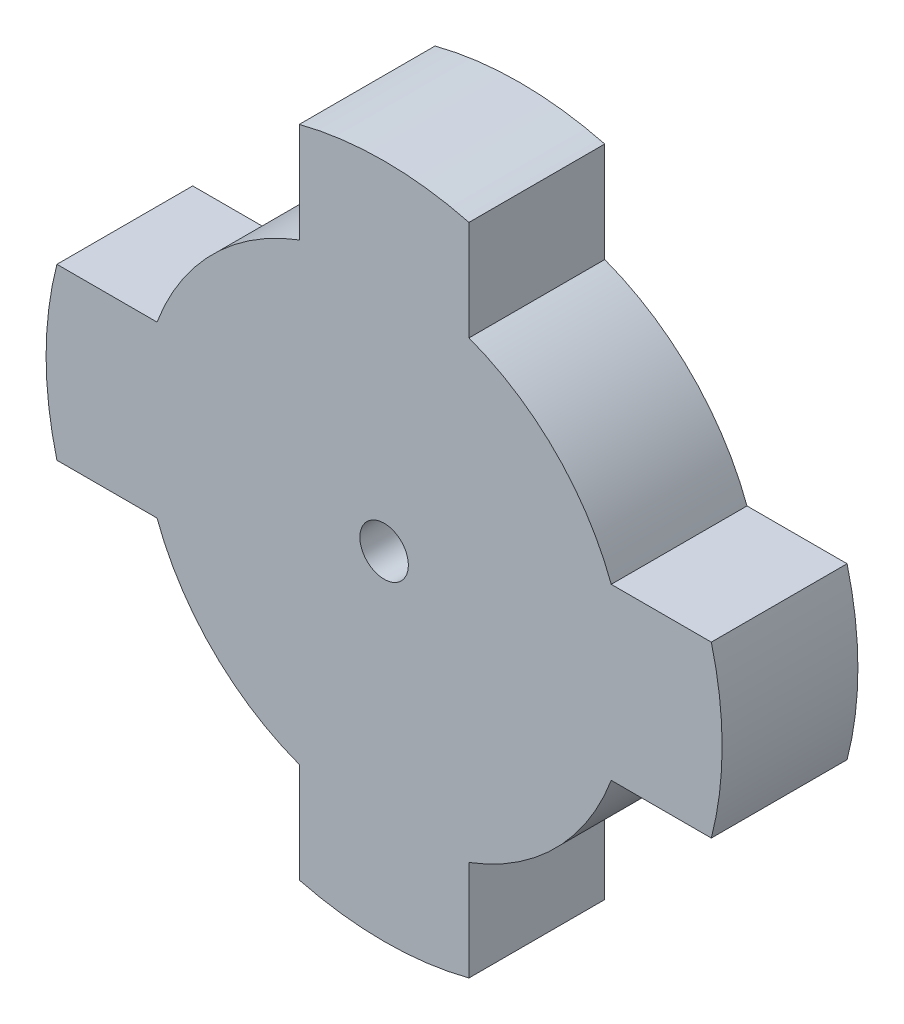
ISO-10303-21;
HEADER;
FILE_DESCRIPTION(('STEP AP214'),'2;1');
FILE_NAME('part.step','',(''),(''),'','','');
FILE_SCHEMA(('AUTOMOTIVE_DESIGN { 1 0 10303 214 1 1 1 1 }'));
ENDSEC;
DATA;
#1=APPLICATION_CONTEXT('core data for automotive mechanical design processes');
#2=APPLICATION_PROTOCOL_DEFINITION('international standard','automotive_design',2000,#1);
#3=PRODUCT_CONTEXT('',#1,'mechanical');
#4=PRODUCT('Part','Part','',(#3));
#5=PRODUCT_RELATED_PRODUCT_CATEGORY('part','',(#4));
#6=PRODUCT_DEFINITION_FORMATION('','',#4);
#7=PRODUCT_DEFINITION_CONTEXT('part definition',#1,'design');
#8=PRODUCT_DEFINITION('design','',#6,#7);
#9=PRODUCT_DEFINITION_SHAPE('','',#8);
#10=(LENGTH_UNIT() NAMED_UNIT(*) SI_UNIT(.MILLI.,.METRE.));
#11=(NAMED_UNIT(*) PLANE_ANGLE_UNIT() SI_UNIT($,.RADIAN.));
#12=(NAMED_UNIT(*) SI_UNIT($,.STERADIAN.) SOLID_ANGLE_UNIT());
#13=UNCERTAINTY_MEASURE_WITH_UNIT(LENGTH_MEASURE(1.E-05),#10,'distance_accuracy_value','');
#14=(GEOMETRIC_REPRESENTATION_CONTEXT(3) GLOBAL_UNCERTAINTY_ASSIGNED_CONTEXT((#13)) GLOBAL_UNIT_ASSIGNED_CONTEXT((#10,
#11,#12)) REPRESENTATION_CONTEXT('',''));
#15=CARTESIAN_POINT('',(0.,0.,0.));
#16=DIRECTION('',(0.,0.,1.));
#17=DIRECTION('',(1.,0.,0.));
#18=AXIS2_PLACEMENT_3D('',#15,#16,#17);
#19=CARTESIAN_POINT('',(0.,0.,14.));
#20=DIRECTION('',(0.,0.,1.));
#21=DIRECTION('',(1.,0.,0.));
#22=AXIS2_PLACEMENT_3D('',#19,#20,#21);
#23=PLANE('',#22);
#24=CARTESIAN_POINT('',(0.,0.,14.));
#25=DIRECTION('',(0.,0.,1.));
#26=DIRECTION('',(1.,0.,0.));
#27=AXIS2_PLACEMENT_3D('',#24,#25,#26);
#28=CIRCLE('',#27,25.);
#29=CARTESIAN_POINT('',(23.418742493994,8.75,14.));
#30=VERTEX_POINT('',#29);
#31=CARTESIAN_POINT('',(8.75,23.418742493994,14.));
#32=VERTEX_POINT('',#31);
#33=EDGE_CURVE('E212',#30,#32,#28,.T.);
#34=ORIENTED_EDGE('',*,*,#33,.T.);
#35=DIRECTION('',(0.,1.,0.));
#36=VECTOR('',#35,1.);
#37=CARTESIAN_POINT('',(8.75,33.7378187340218,14.));
#38=LINE('',#37,#36);
#39=CARTESIAN_POINT('',(8.75,33.7378187340218,14.));
#40=VERTEX_POINT('',#39);
#41=EDGE_CURVE('E120',#32,#40,#38,.T.);
#42=ORIENTED_EDGE('',*,*,#41,.T.);
#43=CARTESIAN_POINT('',(0.,0.,14.));
#44=DIRECTION('',(0.,0.,1.));
#45=DIRECTION('',(1.,0.,0.));
#46=AXIS2_PLACEMENT_3D('',#43,#44,#45);
#47=CIRCLE('',#46,34.8540229088367);
#48=CARTESIAN_POINT('',(-8.75,33.7378187340218,14.));
#49=VERTEX_POINT('',#48);
#50=EDGE_CURVE('E251',#40,#49,#47,.T.);
#51=ORIENTED_EDGE('',*,*,#50,.T.);
#52=DIRECTION('',(0.,-1.,0.));
#53=VECTOR('',#52,1.);
#54=CARTESIAN_POINT('',(-8.75,33.7378187340218,14.));
#55=LINE('',#54,#53);
#56=CARTESIAN_POINT('',(-8.75,23.418742493994,14.));
#57=VERTEX_POINT('',#56);
#58=EDGE_CURVE('E270',#49,#57,#55,.T.);
#59=ORIENTED_EDGE('',*,*,#58,.T.);
#60=CARTESIAN_POINT('',(0.,0.,14.));
#61=DIRECTION('',(0.,0.,1.));
#62=DIRECTION('',(1.,0.,0.));
#63=AXIS2_PLACEMENT_3D('',#60,#61,#62);
#64=CIRCLE('',#63,25.);
#65=CARTESIAN_POINT('',(-23.418742493994,8.75,14.));
#66=VERTEX_POINT('',#65);
#67=EDGE_CURVE('E267',#57,#66,#64,.T.);
#68=ORIENTED_EDGE('',*,*,#67,.T.);
#69=DIRECTION('',(-1.,0.,0.));
#70=VECTOR('',#69,1.);
#71=CARTESIAN_POINT('',(-33.7378187340218,8.74999999999999,14.));
#72=LINE('',#71,#70);
#73=CARTESIAN_POINT('',(-33.7378187340218,8.74999999999999,14.));
#74=VERTEX_POINT('',#73);
#75=EDGE_CURVE('E269',#66,#74,#72,.T.);
#76=ORIENTED_EDGE('',*,*,#75,.T.);
#77=CARTESIAN_POINT('',(0.,0.,14.));
#78=DIRECTION('',(0.,0.,1.));
#79=DIRECTION('',(1.,0.,0.));
#80=AXIS2_PLACEMENT_3D('',#77,#78,#79);
#81=CIRCLE('',#80,34.8540229088367);
#82=CARTESIAN_POINT('',(-33.7378187340218,-8.75,14.));
#83=VERTEX_POINT('',#82);
#84=EDGE_CURVE('E272',#74,#83,#81,.T.);
#85=ORIENTED_EDGE('',*,*,#84,.T.);
#86=DIRECTION('',(1.,0.,0.));
#87=VECTOR('',#86,1.);
#88=CARTESIAN_POINT('',(-33.7378187340218,-8.75000000000001,14.));
#89=LINE('',#88,#87);
#90=CARTESIAN_POINT('',(-23.418742493994,-8.75,14.));
#91=VERTEX_POINT('',#90);
#92=EDGE_CURVE('E278',#83,#91,#89,.T.);
#93=ORIENTED_EDGE('',*,*,#92,.T.);
#94=CARTESIAN_POINT('',(0.,0.,14.));
#95=DIRECTION('',(0.,0.,1.));
#96=DIRECTION('',(1.,0.,0.));
#97=AXIS2_PLACEMENT_3D('',#94,#95,#96);
#98=CIRCLE('',#97,25.);
#99=CARTESIAN_POINT('',(-8.75,-23.418742493994,14.));
#100=VERTEX_POINT('',#99);
#101=EDGE_CURVE('E280',#91,#100,#98,.T.);
#102=ORIENTED_EDGE('',*,*,#101,.T.);
#103=DIRECTION('',(0.,-1.,0.));
#104=VECTOR('',#103,1.);
#105=CARTESIAN_POINT('',(-8.75,-33.7378187340218,14.));
#106=LINE('',#105,#104);
#107=CARTESIAN_POINT('',(-8.75,-33.7378187340218,14.));
#108=VERTEX_POINT('',#107);
#109=EDGE_CURVE('E282',#100,#108,#106,.T.);
#110=ORIENTED_EDGE('',*,*,#109,.T.);
#111=CARTESIAN_POINT('',(0.,0.,14.));
#112=DIRECTION('',(0.,0.,1.));
#113=DIRECTION('',(1.,0.,0.));
#114=AXIS2_PLACEMENT_3D('',#111,#112,#113);
#115=CIRCLE('',#114,34.8540229088367);
#116=CARTESIAN_POINT('',(8.75,-33.7378187340218,14.));
#117=VERTEX_POINT('',#116);
#118=EDGE_CURVE('E284',#108,#117,#115,.T.);
#119=ORIENTED_EDGE('',*,*,#118,.T.);
#120=DIRECTION('',(0.,1.,0.));
#121=VECTOR('',#120,1.);
#122=CARTESIAN_POINT('',(8.75000000000001,-33.7378187340218,14.));
#123=LINE('',#122,#121);
#124=CARTESIAN_POINT('',(8.75,-23.418742493994,14.));
#125=VERTEX_POINT('',#124);
#126=EDGE_CURVE('E286',#117,#125,#123,.T.);
#127=ORIENTED_EDGE('',*,*,#126,.T.);
#128=CARTESIAN_POINT('',(0.,0.,14.));
#129=DIRECTION('',(0.,0.,1.));
#130=DIRECTION('',(1.,0.,0.));
#131=AXIS2_PLACEMENT_3D('',#128,#129,#130);
#132=CIRCLE('',#131,25.);
#133=CARTESIAN_POINT('',(23.418742493994,-8.75,14.));
#134=VERTEX_POINT('',#133);
#135=EDGE_CURVE('E163',#125,#134,#132,.T.);
#136=ORIENTED_EDGE('',*,*,#135,.T.);
#137=DIRECTION('',(1.,0.,0.));
#138=VECTOR('',#137,1.);
#139=CARTESIAN_POINT('',(33.7378187340218,-8.75,14.));
#140=LINE('',#139,#138);
#141=CARTESIAN_POINT('',(33.7378187340218,-8.75,14.));
#142=VERTEX_POINT('',#141);
#143=EDGE_CURVE('E157',#134,#142,#140,.T.);
#144=ORIENTED_EDGE('',*,*,#143,.T.);
#145=CARTESIAN_POINT('',(0.,0.,14.));
#146=DIRECTION('',(0.,0.,1.));
#147=DIRECTION('',(1.,0.,0.));
#148=AXIS2_PLACEMENT_3D('',#145,#146,#147);
#149=CIRCLE('',#148,34.8540229088367);
#150=CARTESIAN_POINT('',(33.7378187340218,8.75000000000001,14.));
#151=VERTEX_POINT('',#150);
#152=EDGE_CURVE('E161',#142,#151,#149,.T.);
#153=ORIENTED_EDGE('',*,*,#152,.T.);
#154=DIRECTION('',(-1.,0.,0.));
#155=VECTOR('',#154,1.);
#156=CARTESIAN_POINT('',(33.7378187340218,8.75,14.));
#157=LINE('',#156,#155);
#158=EDGE_CURVE('E53',#151,#30,#157,.T.);
#159=ORIENTED_EDGE('',*,*,#158,.T.);
#160=EDGE_LOOP('',(#34,#42,#51,#59,#68,#76,#85,#93,#102,#110,#119,#127,#136,#144,#153,#159));
#161=FACE_BOUND('',#160,.T.);
#162=CARTESIAN_POINT('',(0.,0.,14.));
#163=DIRECTION('',(0.,0.,1.));
#164=DIRECTION('',(1.,0.,0.));
#165=AXIS2_PLACEMENT_3D('',#162,#163,#164);
#166=CIRCLE('',#165,2.5);
#167=CARTESIAN_POINT('',(2.5,0.,14.));
#168=VERTEX_POINT('',#167);
#169=EDGE_CURVE('E185',#168,#168,#166,.T.);
#170=ORIENTED_EDGE('',*,*,#169,.F.);
#171=EDGE_LOOP('',(#170));
#172=FACE_BOUND('',#171,.T.);
#173=ADVANCED_FACE('F36',(#161,#172),#23,.T.);
#174=CARTESIAN_POINT('',(0.,0.,0.));
#175=DIRECTION('',(0.,0.,1.));
#176=DIRECTION('',(1.,0.,0.));
#177=AXIS2_PLACEMENT_3D('',#174,#175,#176);
#178=PLANE('',#177);
#179=CARTESIAN_POINT('',(0.,0.,0.));
#180=DIRECTION('',(0.,0.,1.));
#181=DIRECTION('',(1.,0.,0.));
#182=AXIS2_PLACEMENT_3D('',#179,#180,#181);
#183=CIRCLE('',#182,25.);
#184=CARTESIAN_POINT('',(23.418742493994,8.75,0.));
#185=VERTEX_POINT('',#184);
#186=CARTESIAN_POINT('',(8.75,23.418742493994,0.));
#187=VERTEX_POINT('',#186);
#188=EDGE_CURVE('E181',#185,#187,#183,.T.);
#189=ORIENTED_EDGE('',*,*,#188,.F.);
#190=DIRECTION('',(-1.,0.,0.));
#191=VECTOR('',#190,1.);
#192=CARTESIAN_POINT('',(33.7378187340218,8.75,0.));
#193=LINE('',#192,#191);
#194=CARTESIAN_POINT('',(33.7378187340218,8.75000000000001,0.));
#195=VERTEX_POINT('',#194);
#196=EDGE_CURVE('E112',#195,#185,#193,.T.);
#197=ORIENTED_EDGE('',*,*,#196,.F.);
#198=CARTESIAN_POINT('',(0.,0.,0.));
#199=DIRECTION('',(0.,0.,1.));
#200=DIRECTION('',(1.,0.,0.));
#201=AXIS2_PLACEMENT_3D('',#198,#199,#200);
#202=CIRCLE('',#201,34.8540229088367);
#203=CARTESIAN_POINT('',(33.7378187340218,-8.75,0.));
#204=VERTEX_POINT('',#203);
#205=EDGE_CURVE('E106',#204,#195,#202,.T.);
#206=ORIENTED_EDGE('',*,*,#205,.F.);
#207=DIRECTION('',(1.,0.,0.));
#208=VECTOR('',#207,1.);
#209=CARTESIAN_POINT('',(33.7378187340218,-8.75,0.));
#210=LINE('',#209,#208);
#211=CARTESIAN_POINT('',(23.418742493994,-8.75,0.));
#212=VERTEX_POINT('',#211);
#213=EDGE_CURVE('E171',#212,#204,#210,.T.);
#214=ORIENTED_EDGE('',*,*,#213,.F.);
#215=CARTESIAN_POINT('',(0.,0.,0.));
#216=DIRECTION('',(0.,0.,1.));
#217=DIRECTION('',(1.,0.,0.));
#218=AXIS2_PLACEMENT_3D('',#215,#216,#217);
#219=CIRCLE('',#218,25.);
#220=CARTESIAN_POINT('',(8.75,-23.418742493994,0.));
#221=VERTEX_POINT('',#220);
#222=EDGE_CURVE('E207',#221,#212,#219,.T.);
#223=ORIENTED_EDGE('',*,*,#222,.F.);
#224=DIRECTION('',(0.,1.,0.));
#225=VECTOR('',#224,1.);
#226=CARTESIAN_POINT('',(8.75000000000001,-33.7378187340218,0.));
#227=LINE('',#226,#225);
#228=CARTESIAN_POINT('',(8.75,-33.7378187340218,0.));
#229=VERTEX_POINT('',#228);
#230=EDGE_CURVE('E205',#229,#221,#227,.T.);
#231=ORIENTED_EDGE('',*,*,#230,.F.);
#232=CARTESIAN_POINT('',(0.,0.,0.));
#233=DIRECTION('',(0.,0.,1.));
#234=DIRECTION('',(1.,0.,0.));
#235=AXIS2_PLACEMENT_3D('',#232,#233,#234);
#236=CIRCLE('',#235,34.8540229088367);
#237=CARTESIAN_POINT('',(-8.75,-33.7378187340218,0.));
#238=VERTEX_POINT('',#237);
#239=EDGE_CURVE('E203',#238,#229,#236,.T.);
#240=ORIENTED_EDGE('',*,*,#239,.F.);
#241=DIRECTION('',(0.,-1.,0.));
#242=VECTOR('',#241,1.);
#243=CARTESIAN_POINT('',(-8.75,-33.7378187340218,0.));
#244=LINE('',#243,#242);
#245=CARTESIAN_POINT('',(-8.75,-23.418742493994,0.));
#246=VERTEX_POINT('',#245);
#247=EDGE_CURVE('E201',#246,#238,#244,.T.);
#248=ORIENTED_EDGE('',*,*,#247,.F.);
#249=CARTESIAN_POINT('',(0.,0.,0.));
#250=DIRECTION('',(0.,0.,1.));
#251=DIRECTION('',(1.,0.,0.));
#252=AXIS2_PLACEMENT_3D('',#249,#250,#251);
#253=CIRCLE('',#252,25.);
#254=CARTESIAN_POINT('',(-23.418742493994,-8.75,0.));
#255=VERTEX_POINT('',#254);
#256=EDGE_CURVE('E199',#255,#246,#253,.T.);
#257=ORIENTED_EDGE('',*,*,#256,.F.);
#258=DIRECTION('',(1.,0.,0.));
#259=VECTOR('',#258,1.);
#260=CARTESIAN_POINT('',(-33.7378187340218,-8.75000000000001,0.));
#261=LINE('',#260,#259);
#262=CARTESIAN_POINT('',(-33.7378187340218,-8.75,0.));
#263=VERTEX_POINT('',#262);
#264=EDGE_CURVE('E197',#263,#255,#261,.T.);
#265=ORIENTED_EDGE('',*,*,#264,.F.);
#266=CARTESIAN_POINT('',(0.,0.,0.));
#267=DIRECTION('',(0.,0.,1.));
#268=DIRECTION('',(1.,0.,0.));
#269=AXIS2_PLACEMENT_3D('',#266,#267,#268);
#270=CIRCLE('',#269,34.8540229088367);
#271=CARTESIAN_POINT('',(-33.7378187340218,8.74999999999999,0.));
#272=VERTEX_POINT('',#271);
#273=EDGE_CURVE('E195',#272,#263,#270,.T.);
#274=ORIENTED_EDGE('',*,*,#273,.F.);
#275=DIRECTION('',(-1.,0.,0.));
#276=VECTOR('',#275,1.);
#277=CARTESIAN_POINT('',(-33.7378187340218,8.74999999999999,0.));
#278=LINE('',#277,#276);
#279=CARTESIAN_POINT('',(-23.418742493994,8.75,0.));
#280=VERTEX_POINT('',#279);
#281=EDGE_CURVE('E193',#280,#272,#278,.T.);
#282=ORIENTED_EDGE('',*,*,#281,.F.);
#283=CARTESIAN_POINT('',(0.,0.,0.));
#284=DIRECTION('',(0.,0.,1.));
#285=DIRECTION('',(1.,0.,0.));
#286=AXIS2_PLACEMENT_3D('',#283,#284,#285);
#287=CIRCLE('',#286,25.);
#288=CARTESIAN_POINT('',(-8.75,23.418742493994,0.));
#289=VERTEX_POINT('',#288);
#290=EDGE_CURVE('E191',#289,#280,#287,.T.);
#291=ORIENTED_EDGE('',*,*,#290,.F.);
#292=DIRECTION('',(0.,-1.,0.));
#293=VECTOR('',#292,1.);
#294=CARTESIAN_POINT('',(-8.75,33.7378187340218,0.));
#295=LINE('',#294,#293);
#296=CARTESIAN_POINT('',(-8.75,33.7378187340218,0.));
#297=VERTEX_POINT('',#296);
#298=EDGE_CURVE('E189',#297,#289,#295,.T.);
#299=ORIENTED_EDGE('',*,*,#298,.F.);
#300=CARTESIAN_POINT('',(0.,0.,0.));
#301=DIRECTION('',(0.,0.,1.));
#302=DIRECTION('',(1.,0.,0.));
#303=AXIS2_PLACEMENT_3D('',#300,#301,#302);
#304=CIRCLE('',#303,34.8540229088367);
#305=CARTESIAN_POINT('',(8.75,33.7378187340218,0.));
#306=VERTEX_POINT('',#305);
#307=EDGE_CURVE('E187',#306,#297,#304,.T.);
#308=ORIENTED_EDGE('',*,*,#307,.F.);
#309=DIRECTION('',(0.,1.,0.));
#310=VECTOR('',#309,1.);
#311=CARTESIAN_POINT('',(8.75,33.7378187340218,0.));
#312=LINE('',#311,#310);
#313=EDGE_CURVE('E184',#187,#306,#312,.T.);
#314=ORIENTED_EDGE('',*,*,#313,.F.);
#315=EDGE_LOOP('',(#189,#197,#206,#214,#223,#231,#240,#248,#257,#265,#274,#282,#291,#299,#308,#314));
#316=FACE_BOUND('',#315,.T.);
#317=CARTESIAN_POINT('',(0.,0.,0.));
#318=DIRECTION('',(0.,0.,1.));
#319=DIRECTION('',(1.,0.,0.));
#320=AXIS2_PLACEMENT_3D('',#317,#318,#319);
#321=CIRCLE('',#320,2.5);
#322=CARTESIAN_POINT('',(2.5,0.,0.));
#323=VERTEX_POINT('',#322);
#324=EDGE_CURVE('E485',#323,#323,#321,.T.);
#325=ORIENTED_EDGE('',*,*,#324,.T.);
#326=EDGE_LOOP('',(#325));
#327=FACE_BOUND('',#326,.T.);
#328=ADVANCED_FACE('F255',(#316,#327),#178,.F.);
#329=CARTESIAN_POINT('',(0.,0.,14.));
#330=DIRECTION('',(0.,0.,-1.));
#331=DIRECTION('',(-1.,0.,0.));
#332=AXIS2_PLACEMENT_3D('',#329,#330,#331);
#333=CYLINDRICAL_SURFACE('',#332,25.);
#334=ORIENTED_EDGE('',*,*,#188,.T.);
#335=DIRECTION('',(0.,0.,-1.));
#336=VECTOR('',#335,1.);
#337=CARTESIAN_POINT('',(8.75,23.418742493994,14.));
#338=LINE('',#337,#336);
#339=EDGE_CURVE('E11',#32,#187,#338,.T.);
#340=ORIENTED_EDGE('',*,*,#339,.F.);
#341=ORIENTED_EDGE('',*,*,#33,.F.);
#342=DIRECTION('',(0.,0.,-1.));
#343=VECTOR('',#342,1.);
#344=CARTESIAN_POINT('',(23.418742493994,8.75,14.));
#345=LINE('',#344,#343);
#346=EDGE_CURVE('E177',#30,#185,#345,.T.);
#347=ORIENTED_EDGE('',*,*,#346,.T.);
#348=EDGE_LOOP('',(#334,#340,#341,#347));
#349=FACE_BOUND('',#348,.T.);
#350=ADVANCED_FACE('F38',(#349),#333,.T.);
#351=CARTESIAN_POINT('',(8.75,33.7378187340218,14.));
#352=DIRECTION('',(-1.,0.,0.));
#353=DIRECTION('',(0.,0.,1.));
#354=AXIS2_PLACEMENT_3D('',#351,#352,#353);
#355=PLANE('',#354);
#356=ORIENTED_EDGE('',*,*,#313,.T.);
#357=DIRECTION('',(0.,0.,-1.));
#358=VECTOR('',#357,1.);
#359=CARTESIAN_POINT('',(8.75,33.7378187340218,14.));
#360=LINE('',#359,#358);
#361=EDGE_CURVE('E45',#40,#306,#360,.T.);
#362=ORIENTED_EDGE('',*,*,#361,.F.);
#363=ORIENTED_EDGE('',*,*,#41,.F.);
#364=ORIENTED_EDGE('',*,*,#339,.T.);
#365=EDGE_LOOP('',(#356,#362,#363,#364));
#366=FACE_BOUND('',#365,.T.);
#367=ADVANCED_FACE('F320',(#366),#355,.F.);
#368=CARTESIAN_POINT('',(0.,0.,14.));
#369=DIRECTION('',(0.,0.,-1.));
#370=DIRECTION('',(-1.,0.,0.));
#371=AXIS2_PLACEMENT_3D('',#368,#369,#370);
#372=CYLINDRICAL_SURFACE('',#371,34.8540229088367);
#373=ORIENTED_EDGE('',*,*,#307,.T.);
#374=DIRECTION('',(0.,0.,-1.));
#375=VECTOR('',#374,1.);
#376=CARTESIAN_POINT('',(-8.75,33.7378187340218,14.));
#377=LINE('',#376,#375);
#378=EDGE_CURVE('E243',#49,#297,#377,.T.);
#379=ORIENTED_EDGE('',*,*,#378,.F.);
#380=ORIENTED_EDGE('',*,*,#50,.F.);
#381=ORIENTED_EDGE('',*,*,#361,.T.);
#382=EDGE_LOOP('',(#373,#379,#380,#381));
#383=FACE_BOUND('',#382,.T.);
#384=ADVANCED_FACE('F249',(#383),#372,.T.);
#385=CARTESIAN_POINT('',(-8.75,33.7378187340218,14.));
#386=DIRECTION('',(1.,0.,0.));
#387=DIRECTION('',(0.,0.,-1.));
#388=AXIS2_PLACEMENT_3D('',#385,#386,#387);
#389=PLANE('',#388);
#390=ORIENTED_EDGE('',*,*,#298,.T.);
#391=DIRECTION('',(0.,0.,-1.));
#392=VECTOR('',#391,1.);
#393=CARTESIAN_POINT('',(-8.75,23.418742493994,14.));
#394=LINE('',#393,#392);
#395=EDGE_CURVE('E240',#57,#289,#394,.T.);
#396=ORIENTED_EDGE('',*,*,#395,.F.);
#397=ORIENTED_EDGE('',*,*,#58,.F.);
#398=ORIENTED_EDGE('',*,*,#378,.T.);
#399=EDGE_LOOP('',(#390,#396,#397,#398));
#400=FACE_BOUND('',#399,.T.);
#401=ADVANCED_FACE('F261',(#400),#389,.F.);
#402=CARTESIAN_POINT('',(0.,0.,14.));
#403=DIRECTION('',(0.,0.,-1.));
#404=DIRECTION('',(-1.,0.,0.));
#405=AXIS2_PLACEMENT_3D('',#402,#403,#404);
#406=CYLINDRICAL_SURFACE('',#405,25.);
#407=ORIENTED_EDGE('',*,*,#290,.T.);
#408=DIRECTION('',(0.,0.,-1.));
#409=VECTOR('',#408,1.);
#410=CARTESIAN_POINT('',(-23.418742493994,8.75,14.));
#411=LINE('',#410,#409);
#412=EDGE_CURVE('E237',#66,#280,#411,.T.);
#413=ORIENTED_EDGE('',*,*,#412,.F.);
#414=ORIENTED_EDGE('',*,*,#67,.F.);
#415=ORIENTED_EDGE('',*,*,#395,.T.);
#416=EDGE_LOOP('',(#407,#413,#414,#415));
#417=FACE_BOUND('',#416,.T.);
#418=ADVANCED_FACE('F265',(#417),#406,.T.);
#419=CARTESIAN_POINT('',(-33.7378187340218,8.74999999999999,14.));
#420=DIRECTION('',(0.,-1.,0.));
#421=DIRECTION('',(1.,0.,0.));
#422=AXIS2_PLACEMENT_3D('',#419,#420,#421);
#423=PLANE('',#422);
#424=ORIENTED_EDGE('',*,*,#281,.T.);
#425=DIRECTION('',(0.,0.,-1.));
#426=VECTOR('',#425,1.);
#427=CARTESIAN_POINT('',(-33.7378187340218,8.74999999999999,14.));
#428=LINE('',#427,#426);
#429=EDGE_CURVE('E234',#74,#272,#428,.T.);
#430=ORIENTED_EDGE('',*,*,#429,.F.);
#431=ORIENTED_EDGE('',*,*,#75,.F.);
#432=ORIENTED_EDGE('',*,*,#412,.T.);
#433=EDGE_LOOP('',(#424,#430,#431,#432));
#434=FACE_BOUND('',#433,.T.);
#435=ADVANCED_FACE('F333',(#434),#423,.F.);
#436=CARTESIAN_POINT('',(0.,0.,14.));
#437=DIRECTION('',(0.,0.,-1.));
#438=DIRECTION('',(-1.,0.,0.));
#439=AXIS2_PLACEMENT_3D('',#436,#437,#438);
#440=CYLINDRICAL_SURFACE('',#439,34.8540229088367);
#441=ORIENTED_EDGE('',*,*,#273,.T.);
#442=DIRECTION('',(0.,0.,-1.));
#443=VECTOR('',#442,1.);
#444=CARTESIAN_POINT('',(-33.7378187340218,-8.75,14.));
#445=LINE('',#444,#443);
#446=EDGE_CURVE('E231',#83,#263,#445,.T.);
#447=ORIENTED_EDGE('',*,*,#446,.F.);
#448=ORIENTED_EDGE('',*,*,#84,.F.);
#449=ORIENTED_EDGE('',*,*,#429,.T.);
#450=EDGE_LOOP('',(#441,#447,#448,#449));
#451=FACE_BOUND('',#450,.T.);
#452=ADVANCED_FACE('F336',(#451),#440,.T.);
#453=CARTESIAN_POINT('',(-33.7378187340218,-8.75000000000001,14.));
#454=DIRECTION('',(0.,1.,0.));
#455=DIRECTION('',(-1.,0.,0.));
#456=AXIS2_PLACEMENT_3D('',#453,#454,#455);
#457=PLANE('',#456);
#458=ORIENTED_EDGE('',*,*,#264,.T.);
#459=DIRECTION('',(0.,0.,-1.));
#460=VECTOR('',#459,1.);
#461=CARTESIAN_POINT('',(-23.418742493994,-8.75,14.));
#462=LINE('',#461,#460);
#463=EDGE_CURVE('E228',#91,#255,#462,.T.);
#464=ORIENTED_EDGE('',*,*,#463,.F.);
#465=ORIENTED_EDGE('',*,*,#92,.F.);
#466=ORIENTED_EDGE('',*,*,#446,.T.);
#467=EDGE_LOOP('',(#458,#464,#465,#466));
#468=FACE_BOUND('',#467,.T.);
#469=ADVANCED_FACE('F340',(#468),#457,.F.);
#470=CARTESIAN_POINT('',(0.,0.,14.));
#471=DIRECTION('',(0.,0.,-1.));
#472=DIRECTION('',(-1.,0.,0.));
#473=AXIS2_PLACEMENT_3D('',#470,#471,#472);
#474=CYLINDRICAL_SURFACE('',#473,25.);
#475=ORIENTED_EDGE('',*,*,#256,.T.);
#476=DIRECTION('',(0.,0.,-1.));
#477=VECTOR('',#476,1.);
#478=CARTESIAN_POINT('',(-8.75,-23.418742493994,14.));
#479=LINE('',#478,#477);
#480=EDGE_CURVE('E225',#100,#246,#479,.T.);
#481=ORIENTED_EDGE('',*,*,#480,.F.);
#482=ORIENTED_EDGE('',*,*,#101,.F.);
#483=ORIENTED_EDGE('',*,*,#463,.T.);
#484=EDGE_LOOP('',(#475,#481,#482,#483));
#485=FACE_BOUND('',#484,.T.);
#486=ADVANCED_FACE('F344',(#485),#474,.T.);
#487=CARTESIAN_POINT('',(-8.75,-33.7378187340218,14.));
#488=DIRECTION('',(1.,0.,0.));
#489=DIRECTION('',(0.,1.,0.));
#490=AXIS2_PLACEMENT_3D('',#487,#488,#489);
#491=PLANE('',#490);
#492=ORIENTED_EDGE('',*,*,#247,.T.);
#493=DIRECTION('',(0.,0.,-1.));
#494=VECTOR('',#493,1.);
#495=CARTESIAN_POINT('',(-8.75,-33.7378187340218,14.));
#496=LINE('',#495,#494);
#497=EDGE_CURVE('E222',#108,#238,#496,.T.);
#498=ORIENTED_EDGE('',*,*,#497,.F.);
#499=ORIENTED_EDGE('',*,*,#109,.F.);
#500=ORIENTED_EDGE('',*,*,#480,.T.);
#501=EDGE_LOOP('',(#492,#498,#499,#500));
#502=FACE_BOUND('',#501,.T.);
#503=ADVANCED_FACE('F348',(#502),#491,.F.);
#504=CARTESIAN_POINT('',(0.,0.,14.));
#505=DIRECTION('',(0.,0.,-1.));
#506=DIRECTION('',(-1.,0.,0.));
#507=AXIS2_PLACEMENT_3D('',#504,#505,#506);
#508=CYLINDRICAL_SURFACE('',#507,34.8540229088367);
#509=ORIENTED_EDGE('',*,*,#239,.T.);
#510=DIRECTION('',(0.,0.,-1.));
#511=VECTOR('',#510,1.);
#512=CARTESIAN_POINT('',(8.75,-33.7378187340218,14.));
#513=LINE('',#512,#511);
#514=EDGE_CURVE('E219',#117,#229,#513,.T.);
#515=ORIENTED_EDGE('',*,*,#514,.F.);
#516=ORIENTED_EDGE('',*,*,#118,.F.);
#517=ORIENTED_EDGE('',*,*,#497,.T.);
#518=EDGE_LOOP('',(#509,#515,#516,#517));
#519=FACE_BOUND('',#518,.T.);
#520=ADVANCED_FACE('F352',(#519),#508,.T.);
#521=CARTESIAN_POINT('',(8.75000000000001,-33.7378187340218,14.));
#522=DIRECTION('',(-1.,0.,0.));
#523=DIRECTION('',(0.,-1.,0.));
#524=AXIS2_PLACEMENT_3D('',#521,#522,#523);
#525=PLANE('',#524);
#526=ORIENTED_EDGE('',*,*,#230,.T.);
#527=DIRECTION('',(0.,0.,-1.));
#528=VECTOR('',#527,1.);
#529=CARTESIAN_POINT('',(8.75,-23.418742493994,14.));
#530=LINE('',#529,#528);
#531=EDGE_CURVE('E216',#125,#221,#530,.T.);
#532=ORIENTED_EDGE('',*,*,#531,.F.);
#533=ORIENTED_EDGE('',*,*,#126,.F.);
#534=ORIENTED_EDGE('',*,*,#514,.T.);
#535=EDGE_LOOP('',(#526,#532,#533,#534));
#536=FACE_BOUND('',#535,.T.);
#537=ADVANCED_FACE('F292',(#536),#525,.F.);
#538=CARTESIAN_POINT('',(0.,0.,14.));
#539=DIRECTION('',(0.,0.,-1.));
#540=DIRECTION('',(-1.,0.,0.));
#541=AXIS2_PLACEMENT_3D('',#538,#539,#540);
#542=CYLINDRICAL_SURFACE('',#541,25.);
#543=ORIENTED_EDGE('',*,*,#222,.T.);
#544=DIRECTION('',(0.,0.,-1.));
#545=VECTOR('',#544,1.);
#546=CARTESIAN_POINT('',(23.418742493994,-8.75,14.));
#547=LINE('',#546,#545);
#548=EDGE_CURVE('E172',#134,#212,#547,.T.);
#549=ORIENTED_EDGE('',*,*,#548,.F.);
#550=ORIENTED_EDGE('',*,*,#135,.F.);
#551=ORIENTED_EDGE('',*,*,#531,.T.);
#552=EDGE_LOOP('',(#543,#549,#550,#551));
#553=FACE_BOUND('',#552,.T.);
#554=ADVANCED_FACE('F296',(#553),#542,.T.);
#555=CARTESIAN_POINT('',(33.7378187340218,-8.75,14.));
#556=DIRECTION('',(0.,1.,0.));
#557=DIRECTION('',(-1.,0.,0.));
#558=AXIS2_PLACEMENT_3D('',#555,#556,#557);
#559=PLANE('',#558);
#560=ORIENTED_EDGE('',*,*,#213,.T.);
#561=DIRECTION('',(0.,0.,-1.));
#562=VECTOR('',#561,1.);
#563=CARTESIAN_POINT('',(33.7378187340218,-8.75,14.));
#564=LINE('',#563,#562);
#565=EDGE_CURVE('E168',#142,#204,#564,.T.);
#566=ORIENTED_EDGE('',*,*,#565,.F.);
#567=ORIENTED_EDGE('',*,*,#143,.F.);
#568=ORIENTED_EDGE('',*,*,#548,.T.);
#569=EDGE_LOOP('',(#560,#566,#567,#568));
#570=FACE_BOUND('',#569,.T.);
#571=ADVANCED_FACE('F169',(#570),#559,.F.);
#572=CARTESIAN_POINT('',(0.,0.,14.));
#573=DIRECTION('',(0.,0.,-1.));
#574=DIRECTION('',(-1.,0.,0.));
#575=AXIS2_PLACEMENT_3D('',#572,#573,#574);
#576=CYLINDRICAL_SURFACE('',#575,34.8540229088367);
#577=ORIENTED_EDGE('',*,*,#205,.T.);
#578=DIRECTION('',(0.,0.,-1.));
#579=VECTOR('',#578,1.);
#580=CARTESIAN_POINT('',(33.7378187340218,8.75000000000001,14.));
#581=LINE('',#580,#579);
#582=EDGE_CURVE('E173',#151,#195,#581,.T.);
#583=ORIENTED_EDGE('',*,*,#582,.F.);
#584=ORIENTED_EDGE('',*,*,#152,.F.);
#585=ORIENTED_EDGE('',*,*,#565,.T.);
#586=EDGE_LOOP('',(#577,#583,#584,#585));
#587=FACE_BOUND('',#586,.T.);
#588=ADVANCED_FACE('F175',(#587),#576,.T.);
#589=CARTESIAN_POINT('',(33.7378187340218,8.75,14.));
#590=DIRECTION('',(0.,-1.,0.));
#591=DIRECTION('',(0.,0.,-1.));
#592=AXIS2_PLACEMENT_3D('',#589,#590,#591);
#593=PLANE('',#592);
#594=ORIENTED_EDGE('',*,*,#196,.T.);
#595=ORIENTED_EDGE('',*,*,#346,.F.);
#596=ORIENTED_EDGE('',*,*,#158,.F.);
#597=ORIENTED_EDGE('',*,*,#582,.T.);
#598=EDGE_LOOP('',(#594,#595,#596,#597));
#599=FACE_BOUND('',#598,.T.);
#600=ADVANCED_FACE('F300',(#599),#593,.F.);
#601=CARTESIAN_POINT('',(0.,0.,14.));
#602=DIRECTION('',(0.,0.,-1.));
#603=DIRECTION('',(-1.,0.,0.));
#604=AXIS2_PLACEMENT_3D('',#601,#602,#603);
#605=CYLINDRICAL_SURFACE('',#604,2.5);
#606=ORIENTED_EDGE('',*,*,#169,.T.);
#607=EDGE_LOOP('',(#606));
#608=FACE_BOUND('',#607,.T.);
#609=ORIENTED_EDGE('',*,*,#324,.F.);
#610=EDGE_LOOP('',(#609));
#611=FACE_BOUND('',#610,.T.);
#612=ADVANCED_FACE('F302',(#608,#611),#605,.F.);
#613=CLOSED_SHELL('',(#173,#328,#350,#367,#384,#401,#418,#435,#452,#469,#486,#503,#520,#537,
#554,#571,#588,#600,#612));
#614=MANIFOLD_SOLID_BREP('B2',#613);
#615=ADVANCED_BREP_SHAPE_REPRESENTATION('',(#18,#614),#14);
#616=SHAPE_DEFINITION_REPRESENTATION(#9,#615);
ENDSEC;
END-ISO-10303-21;
